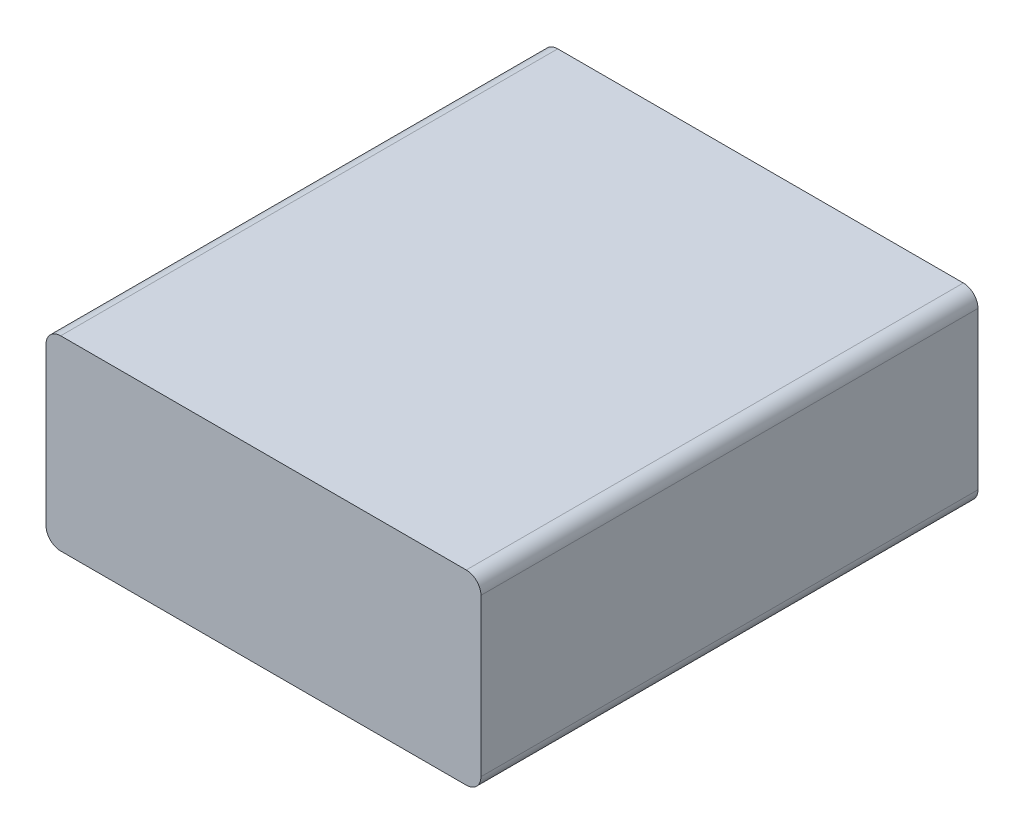
ISO-10303-21;
HEADER;
FILE_DESCRIPTION(('STEP AP214'),'2;1');
FILE_NAME('part.step','',(''),(''),'','','');
FILE_SCHEMA(('AUTOMOTIVE_DESIGN { 1 0 10303 214 1 1 1 1 }'));
ENDSEC;
DATA;
#1=APPLICATION_CONTEXT('core data for automotive mechanical design processes');
#2=APPLICATION_PROTOCOL_DEFINITION('international standard','automotive_design',2000,#1);
#3=PRODUCT_CONTEXT('',#1,'mechanical');
#4=PRODUCT('Part','Part','',(#3));
#5=PRODUCT_RELATED_PRODUCT_CATEGORY('part','',(#4));
#6=PRODUCT_DEFINITION_FORMATION('','',#4);
#7=PRODUCT_DEFINITION_CONTEXT('part definition',#1,'design');
#8=PRODUCT_DEFINITION('design','',#6,#7);
#9=PRODUCT_DEFINITION_SHAPE('','',#8);
#10=(LENGTH_UNIT() NAMED_UNIT(*) SI_UNIT(.MILLI.,.METRE.));
#11=(NAMED_UNIT(*) PLANE_ANGLE_UNIT() SI_UNIT($,.RADIAN.));
#12=(NAMED_UNIT(*) SI_UNIT($,.STERADIAN.) SOLID_ANGLE_UNIT());
#13=UNCERTAINTY_MEASURE_WITH_UNIT(LENGTH_MEASURE(1.E-05),#10,'distance_accuracy_value','');
#14=(GEOMETRIC_REPRESENTATION_CONTEXT(3) GLOBAL_UNCERTAINTY_ASSIGNED_CONTEXT((#13)) GLOBAL_UNIT_ASSIGNED_CONTEXT((#10,
#11,#12)) REPRESENTATION_CONTEXT('',''));
#15=CARTESIAN_POINT('',(0.,0.,0.));
#16=DIRECTION('',(0.,0.,1.));
#17=DIRECTION('',(1.,0.,0.));
#18=AXIS2_PLACEMENT_3D('',#15,#16,#17);
#19=CARTESIAN_POINT('',(-41.45,-16.05,101.6));
#20=DIRECTION('',(0.,0.,-1.));
#21=DIRECTION('',(-1.,0.,0.));
#22=AXIS2_PLACEMENT_3D('',#19,#20,#21);
#23=CYLINDRICAL_SURFACE('',#22,3.);
#24=CARTESIAN_POINT('',(-41.45,-16.05,0.));
#25=DIRECTION('',(0.,0.,1.));
#26=DIRECTION('',(-1.,0.,0.));
#27=AXIS2_PLACEMENT_3D('',#24,#25,#26);
#28=CIRCLE('',#27,3.);
#29=CARTESIAN_POINT('',(-44.45,-16.05,0.));
#30=VERTEX_POINT('',#29);
#31=CARTESIAN_POINT('',(-41.45,-19.05,0.));
#32=VERTEX_POINT('',#31);
#33=EDGE_CURVE('E133',#30,#32,#28,.T.);
#34=ORIENTED_EDGE('',*,*,#33,.T.);
#35=DIRECTION('',(0.,0.,-1.));
#36=VECTOR('',#35,1.);
#37=CARTESIAN_POINT('',(-41.45,-19.05,101.6));
#38=LINE('',#37,#36);
#39=CARTESIAN_POINT('',(-41.45,-19.05,101.6));
#40=VERTEX_POINT('',#39);
#41=EDGE_CURVE('E11',#40,#32,#38,.T.);
#42=ORIENTED_EDGE('',*,*,#41,.F.);
#43=CARTESIAN_POINT('',(-41.45,-16.05,101.6));
#44=DIRECTION('',(0.,0.,1.));
#45=DIRECTION('',(-1.,0.,0.));
#46=AXIS2_PLACEMENT_3D('',#43,#44,#45);
#47=CIRCLE('',#46,3.);
#48=CARTESIAN_POINT('',(-44.45,-16.05,101.6));
#49=VERTEX_POINT('',#48);
#50=EDGE_CURVE('E147',#49,#40,#47,.T.);
#51=ORIENTED_EDGE('',*,*,#50,.F.);
#52=DIRECTION('',(0.,0.,-1.));
#53=VECTOR('',#52,1.);
#54=CARTESIAN_POINT('',(-44.45,-16.05,101.6));
#55=LINE('',#54,#53);
#56=EDGE_CURVE('E129',#49,#30,#55,.T.);
#57=ORIENTED_EDGE('',*,*,#56,.T.);
#58=EDGE_LOOP('',(#34,#42,#51,#57));
#59=FACE_BOUND('',#58,.T.);
#60=ADVANCED_FACE('F37',(#59),#23,.T.);
#61=CARTESIAN_POINT('',(41.45,-19.05,101.6));
#62=DIRECTION('',(0.,1.,0.));
#63=DIRECTION('',(-1.,0.,0.));
#64=AXIS2_PLACEMENT_3D('',#61,#62,#63);
#65=PLANE('',#64);
#66=DIRECTION('',(1.,0.,0.));
#67=VECTOR('',#66,1.);
#68=CARTESIAN_POINT('',(41.45,-19.05,0.));
#69=LINE('',#68,#67);
#70=CARTESIAN_POINT('',(41.45,-19.05,0.));
#71=VERTEX_POINT('',#70);
#72=EDGE_CURVE('E136',#32,#71,#69,.T.);
#73=ORIENTED_EDGE('',*,*,#72,.T.);
#74=DIRECTION('',(0.,0.,-1.));
#75=VECTOR('',#74,1.);
#76=CARTESIAN_POINT('',(41.45,-19.05,101.6));
#77=LINE('',#76,#75);
#78=CARTESIAN_POINT('',(41.45,-19.05,101.6));
#79=VERTEX_POINT('',#78);
#80=EDGE_CURVE('E45',#79,#71,#77,.T.);
#81=ORIENTED_EDGE('',*,*,#80,.F.);
#82=DIRECTION('',(1.,0.,0.));
#83=VECTOR('',#82,1.);
#84=CARTESIAN_POINT('',(41.45,-19.05,101.6));
#85=LINE('',#84,#83);
#86=EDGE_CURVE('E96',#40,#79,#85,.T.);
#87=ORIENTED_EDGE('',*,*,#86,.F.);
#88=ORIENTED_EDGE('',*,*,#41,.T.);
#89=EDGE_LOOP('',(#73,#81,#87,#88));
#90=FACE_BOUND('',#89,.T.);
#91=ADVANCED_FACE('F182',(#90),#65,.F.);
#92=CARTESIAN_POINT('',(41.45,-16.05,101.6));
#93=DIRECTION('',(0.,0.,-1.));
#94=DIRECTION('',(-1.,0.,0.));
#95=AXIS2_PLACEMENT_3D('',#92,#93,#94);
#96=CYLINDRICAL_SURFACE('',#95,3.);
#97=CARTESIAN_POINT('',(41.45,-16.05,0.));
#98=DIRECTION('',(0.,0.,1.));
#99=DIRECTION('',(1.,0.,0.));
#100=AXIS2_PLACEMENT_3D('',#97,#98,#99);
#101=CIRCLE('',#100,3.);
#102=CARTESIAN_POINT('',(44.45,-16.05,0.));
#103=VERTEX_POINT('',#102);
#104=EDGE_CURVE('E138',#71,#103,#101,.T.);
#105=ORIENTED_EDGE('',*,*,#104,.T.);
#106=DIRECTION('',(0.,0.,-1.));
#107=VECTOR('',#106,1.);
#108=CARTESIAN_POINT('',(44.45,-16.05,101.6));
#109=LINE('',#108,#107);
#110=CARTESIAN_POINT('',(44.45,-16.05,101.6));
#111=VERTEX_POINT('',#110);
#112=EDGE_CURVE('E154',#111,#103,#109,.T.);
#113=ORIENTED_EDGE('',*,*,#112,.F.);
#114=CARTESIAN_POINT('',(41.45,-16.05,101.6));
#115=DIRECTION('',(0.,0.,1.));
#116=DIRECTION('',(1.,0.,0.));
#117=AXIS2_PLACEMENT_3D('',#114,#115,#116);
#118=CIRCLE('',#117,3.);
#119=EDGE_CURVE('E162',#79,#111,#118,.T.);
#120=ORIENTED_EDGE('',*,*,#119,.F.);
#121=ORIENTED_EDGE('',*,*,#80,.T.);
#122=EDGE_LOOP('',(#105,#113,#120,#121));
#123=FACE_BOUND('',#122,.T.);
#124=ADVANCED_FACE('F160',(#123),#96,.T.);
#125=CARTESIAN_POINT('',(44.45,-16.05,101.6));
#126=DIRECTION('',(-1.,0.,0.));
#127=DIRECTION('',(0.,0.,1.));
#128=AXIS2_PLACEMENT_3D('',#125,#126,#127);
#129=PLANE('',#128);
#130=DIRECTION('',(0.,1.,0.));
#131=VECTOR('',#130,1.);
#132=CARTESIAN_POINT('',(44.45,-16.05,0.));
#133=LINE('',#132,#131);
#134=CARTESIAN_POINT('',(44.45,16.05,0.));
#135=VERTEX_POINT('',#134);
#136=EDGE_CURVE('E140',#103,#135,#133,.T.);
#137=ORIENTED_EDGE('',*,*,#136,.T.);
#138=DIRECTION('',(0.,0.,-1.));
#139=VECTOR('',#138,1.);
#140=CARTESIAN_POINT('',(44.45,16.05,101.6));
#141=LINE('',#140,#139);
#142=CARTESIAN_POINT('',(44.45,16.05,101.6));
#143=VERTEX_POINT('',#142);
#144=EDGE_CURVE('E151',#143,#135,#141,.T.);
#145=ORIENTED_EDGE('',*,*,#144,.F.);
#146=DIRECTION('',(0.,1.,0.));
#147=VECTOR('',#146,1.);
#148=CARTESIAN_POINT('',(44.45,-16.05,101.6));
#149=LINE('',#148,#147);
#150=EDGE_CURVE('E174',#111,#143,#149,.T.);
#151=ORIENTED_EDGE('',*,*,#150,.F.);
#152=ORIENTED_EDGE('',*,*,#112,.T.);
#153=EDGE_LOOP('',(#137,#145,#151,#152));
#154=FACE_BOUND('',#153,.T.);
#155=ADVANCED_FACE('F170',(#154),#129,.F.);
#156=CARTESIAN_POINT('',(41.45,16.05,101.6));
#157=DIRECTION('',(0.,0.,-1.));
#158=DIRECTION('',(-1.,0.,0.));
#159=AXIS2_PLACEMENT_3D('',#156,#157,#158);
#160=CYLINDRICAL_SURFACE('',#159,3.);
#161=CARTESIAN_POINT('',(41.45,16.05,0.));
#162=DIRECTION('',(0.,0.,1.));
#163=DIRECTION('',(1.,0.,0.));
#164=AXIS2_PLACEMENT_3D('',#161,#162,#163);
#165=CIRCLE('',#164,3.);
#166=CARTESIAN_POINT('',(41.45,19.05,0.));
#167=VERTEX_POINT('',#166);
#168=EDGE_CURVE('E142',#135,#167,#165,.T.);
#169=ORIENTED_EDGE('',*,*,#168,.T.);
#170=DIRECTION('',(0.,0.,-1.));
#171=VECTOR('',#170,1.);
#172=CARTESIAN_POINT('',(41.45,19.05,101.6));
#173=LINE('',#172,#171);
#174=CARTESIAN_POINT('',(41.45,19.05,101.6));
#175=VERTEX_POINT('',#174);
#176=EDGE_CURVE('E124',#175,#167,#173,.T.);
#177=ORIENTED_EDGE('',*,*,#176,.F.);
#178=CARTESIAN_POINT('',(41.45,16.05,101.6));
#179=DIRECTION('',(0.,0.,1.));
#180=DIRECTION('',(1.,0.,0.));
#181=AXIS2_PLACEMENT_3D('',#178,#179,#180);
#182=CIRCLE('',#181,3.);
#183=EDGE_CURVE('E115',#143,#175,#182,.T.);
#184=ORIENTED_EDGE('',*,*,#183,.F.);
#185=ORIENTED_EDGE('',*,*,#144,.T.);
#186=EDGE_LOOP('',(#169,#177,#184,#185));
#187=FACE_BOUND('',#186,.T.);
#188=ADVANCED_FACE('F173',(#187),#160,.T.);
#189=CARTESIAN_POINT('',(41.45,19.05,101.6));
#190=DIRECTION('',(0.,-1.,0.));
#191=DIRECTION('',(1.,0.,0.));
#192=AXIS2_PLACEMENT_3D('',#189,#190,#191);
#193=PLANE('',#192);
#194=DIRECTION('',(-1.,0.,0.));
#195=VECTOR('',#194,1.);
#196=CARTESIAN_POINT('',(41.45,19.05,0.));
#197=LINE('',#196,#195);
#198=CARTESIAN_POINT('',(-41.45,19.05,0.));
#199=VERTEX_POINT('',#198);
#200=EDGE_CURVE('E123',#167,#199,#197,.T.);
#201=ORIENTED_EDGE('',*,*,#200,.T.);
#202=DIRECTION('',(0.,0.,-1.));
#203=VECTOR('',#202,1.);
#204=CARTESIAN_POINT('',(-41.45,19.05,101.6));
#205=LINE('',#204,#203);
#206=CARTESIAN_POINT('',(-41.45,19.05,101.6));
#207=VERTEX_POINT('',#206);
#208=EDGE_CURVE('E120',#207,#199,#205,.T.);
#209=ORIENTED_EDGE('',*,*,#208,.F.);
#210=DIRECTION('',(-1.,0.,0.));
#211=VECTOR('',#210,1.);
#212=CARTESIAN_POINT('',(41.45,19.05,101.6));
#213=LINE('',#212,#211);
#214=EDGE_CURVE('E109',#175,#207,#213,.T.);
#215=ORIENTED_EDGE('',*,*,#214,.F.);
#216=ORIENTED_EDGE('',*,*,#176,.T.);
#217=EDGE_LOOP('',(#201,#209,#215,#216));
#218=FACE_BOUND('',#217,.T.);
#219=ADVANCED_FACE('F121',(#218),#193,.F.);
#220=CARTESIAN_POINT('',(-41.45,16.05,101.6));
#221=DIRECTION('',(0.,0.,-1.));
#222=DIRECTION('',(-1.,0.,0.));
#223=AXIS2_PLACEMENT_3D('',#220,#221,#222);
#224=CYLINDRICAL_SURFACE('',#223,3.);
#225=CARTESIAN_POINT('',(-41.45,16.05,0.));
#226=DIRECTION('',(0.,0.,1.));
#227=DIRECTION('',(1.,0.,0.));
#228=AXIS2_PLACEMENT_3D('',#225,#226,#227);
#229=CIRCLE('',#228,3.);
#230=CARTESIAN_POINT('',(-44.45,16.05,0.));
#231=VERTEX_POINT('',#230);
#232=EDGE_CURVE('E82',#199,#231,#229,.T.);
#233=ORIENTED_EDGE('',*,*,#232,.T.);
#234=DIRECTION('',(0.,0.,-1.));
#235=VECTOR('',#234,1.);
#236=CARTESIAN_POINT('',(-44.45,16.05,101.6));
#237=LINE('',#236,#235);
#238=CARTESIAN_POINT('',(-44.45,16.05,101.6));
#239=VERTEX_POINT('',#238);
#240=EDGE_CURVE('E125',#239,#231,#237,.T.);
#241=ORIENTED_EDGE('',*,*,#240,.F.);
#242=CARTESIAN_POINT('',(-41.45,16.05,101.6));
#243=DIRECTION('',(0.,0.,1.));
#244=DIRECTION('',(1.,0.,0.));
#245=AXIS2_PLACEMENT_3D('',#242,#243,#244);
#246=CIRCLE('',#245,3.);
#247=EDGE_CURVE('E113',#207,#239,#246,.T.);
#248=ORIENTED_EDGE('',*,*,#247,.F.);
#249=ORIENTED_EDGE('',*,*,#208,.T.);
#250=EDGE_LOOP('',(#233,#241,#248,#249));
#251=FACE_BOUND('',#250,.T.);
#252=ADVANCED_FACE('F127',(#251),#224,.T.);
#253=CARTESIAN_POINT('',(-44.45,-16.05,101.6));
#254=DIRECTION('',(1.,0.,0.));
#255=DIRECTION('',(0.,0.,-1.));
#256=AXIS2_PLACEMENT_3D('',#253,#254,#255);
#257=PLANE('',#256);
#258=DIRECTION('',(0.,-1.,0.));
#259=VECTOR('',#258,1.);
#260=CARTESIAN_POINT('',(-44.45,-16.05,0.));
#261=LINE('',#260,#259);
#262=EDGE_CURVE('E88',#231,#30,#261,.T.);
#263=ORIENTED_EDGE('',*,*,#262,.T.);
#264=ORIENTED_EDGE('',*,*,#56,.F.);
#265=DIRECTION('',(0.,-1.,0.));
#266=VECTOR('',#265,1.);
#267=CARTESIAN_POINT('',(-44.45,-16.05,101.6));
#268=LINE('',#267,#266);
#269=EDGE_CURVE('E53',#239,#49,#268,.T.);
#270=ORIENTED_EDGE('',*,*,#269,.F.);
#271=ORIENTED_EDGE('',*,*,#240,.T.);
#272=EDGE_LOOP('',(#263,#264,#270,#271));
#273=FACE_BOUND('',#272,.T.);
#274=ADVANCED_FACE('F198',(#273),#257,.F.);
#275=CARTESIAN_POINT('',(-41.45,-16.05,101.6));
#276=DIRECTION('',(0.,0.,-1.));
#277=DIRECTION('',(-1.,0.,0.));
#278=AXIS2_PLACEMENT_3D('',#275,#276,#277);
#279=PLANE('',#278);
#280=ORIENTED_EDGE('',*,*,#50,.T.);
#281=ORIENTED_EDGE('',*,*,#86,.T.);
#282=ORIENTED_EDGE('',*,*,#119,.T.);
#283=ORIENTED_EDGE('',*,*,#150,.T.);
#284=ORIENTED_EDGE('',*,*,#183,.T.);
#285=ORIENTED_EDGE('',*,*,#214,.T.);
#286=ORIENTED_EDGE('',*,*,#247,.T.);
#287=ORIENTED_EDGE('',*,*,#269,.T.);
#288=EDGE_LOOP('',(#280,#281,#282,#283,#284,#285,#286,#287));
#289=FACE_BOUND('',#288,.T.);
#290=ADVANCED_FACE('F111',(#289),#279,.F.);
#291=CARTESIAN_POINT('',(-41.45,-16.05,0.));
#292=DIRECTION('',(0.,0.,-1.));
#293=DIRECTION('',(-1.,0.,0.));
#294=AXIS2_PLACEMENT_3D('',#291,#292,#293);
#295=PLANE('',#294);
#296=ORIENTED_EDGE('',*,*,#33,.F.);
#297=ORIENTED_EDGE('',*,*,#262,.F.);
#298=ORIENTED_EDGE('',*,*,#232,.F.);
#299=ORIENTED_EDGE('',*,*,#200,.F.);
#300=ORIENTED_EDGE('',*,*,#168,.F.);
#301=ORIENTED_EDGE('',*,*,#136,.F.);
#302=ORIENTED_EDGE('',*,*,#104,.F.);
#303=ORIENTED_EDGE('',*,*,#72,.F.);
#304=EDGE_LOOP('',(#296,#297,#298,#299,#300,#301,#302,#303));
#305=FACE_BOUND('',#304,.T.);
#306=ADVANCED_FACE('F166',(#305),#295,.T.);
#307=CLOSED_SHELL('',(#60,#91,#124,#155,#188,#219,#252,#274,#290,#306));
#308=MANIFOLD_SOLID_BREP('B2',#307);
#309=ADVANCED_BREP_SHAPE_REPRESENTATION('',(#18,#308),#14);
#310=SHAPE_DEFINITION_REPRESENTATION(#9,#309);
ENDSEC;
END-ISO-10303-21;
